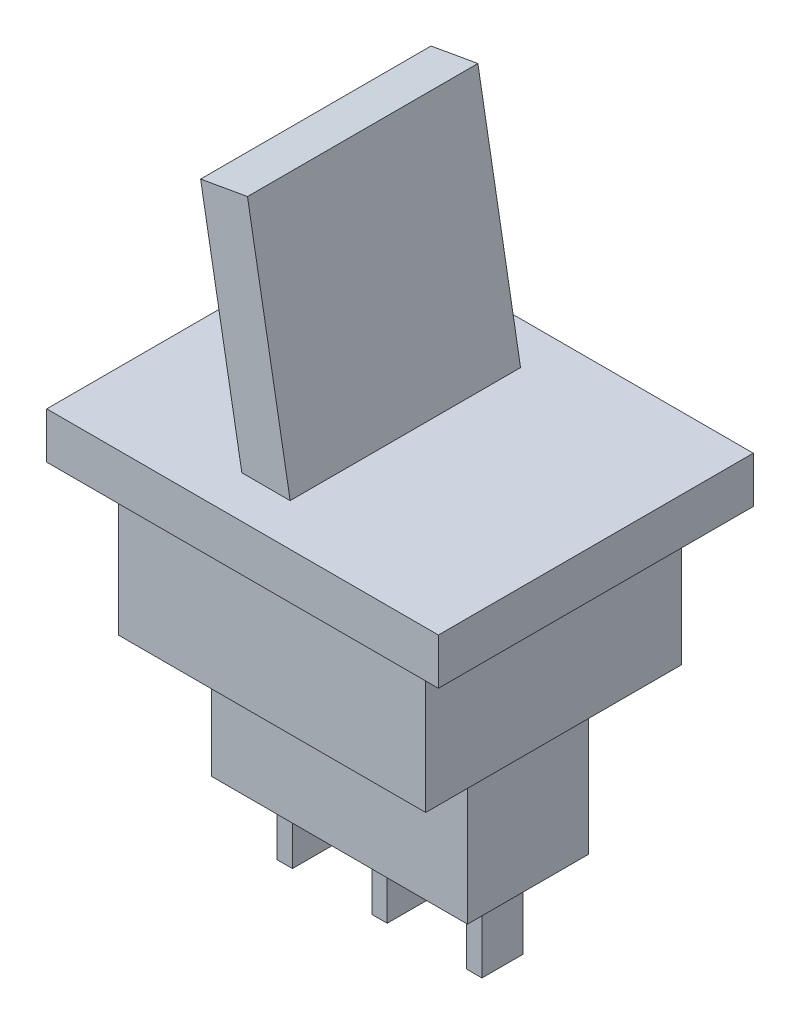
ISO-10303-21;
HEADER;
FILE_DESCRIPTION(('STEP AP214'),'2;1');
FILE_NAME('part.step','',(''),(''),'','','');
FILE_SCHEMA(('AUTOMOTIVE_DESIGN { 1 0 10303 214 1 1 1 1 }'));
ENDSEC;
DATA;
#1=APPLICATION_CONTEXT('core data for automotive mechanical design processes');
#2=APPLICATION_PROTOCOL_DEFINITION('international standard','automotive_design',2000,#1);
#3=PRODUCT_CONTEXT('',#1,'mechanical');
#4=PRODUCT('Part','Part','',(#3));
#5=PRODUCT_RELATED_PRODUCT_CATEGORY('part','',(#4));
#6=PRODUCT_DEFINITION_FORMATION('','',#4);
#7=PRODUCT_DEFINITION_CONTEXT('part definition',#1,'design');
#8=PRODUCT_DEFINITION('design','',#6,#7);
#9=PRODUCT_DEFINITION_SHAPE('','',#8);
#10=(LENGTH_UNIT() NAMED_UNIT(*) SI_UNIT(.MILLI.,.METRE.));
#11=(NAMED_UNIT(*) PLANE_ANGLE_UNIT() SI_UNIT($,.RADIAN.));
#12=(NAMED_UNIT(*) SI_UNIT($,.STERADIAN.) SOLID_ANGLE_UNIT());
#13=UNCERTAINTY_MEASURE_WITH_UNIT(LENGTH_MEASURE(1.E-05),#10,'distance_accuracy_value','');
#14=(GEOMETRIC_REPRESENTATION_CONTEXT(3) GLOBAL_UNCERTAINTY_ASSIGNED_CONTEXT((#13)) GLOBAL_UNIT_ASSIGNED_CONTEXT((#10,
#11,#12)) REPRESENTATION_CONTEXT('',''));
#15=CARTESIAN_POINT('',(0.,0.,0.));
#16=DIRECTION('',(0.,0.,1.));
#17=DIRECTION('',(1.,0.,0.));
#18=AXIS2_PLACEMENT_3D('',#15,#16,#17);
#19=CARTESIAN_POINT('',(0.,-14.22,0.));
#20=DIRECTION('',(0.,-1.,0.));
#21=DIRECTION('',(0.,0.,-1.));
#22=AXIS2_PLACEMENT_3D('',#19,#20,#21);
#23=PLANE('',#22);
#24=DIRECTION('',(0.,0.,1.));
#25=VECTOR('',#24,1.);
#26=CARTESIAN_POINT('',(6.35,-14.22,3.));
#27=LINE('',#26,#25);
#28=CARTESIAN_POINT('',(6.35,-14.22,-3.));
#29=VERTEX_POINT('',#28);
#30=CARTESIAN_POINT('',(6.35,-14.22,3.));
#31=VERTEX_POINT('',#30);
#32=EDGE_CURVE('E334',#29,#31,#27,.T.);
#33=ORIENTED_EDGE('',*,*,#32,.T.);
#34=DIRECTION('',(-1.,0.,0.));
#35=VECTOR('',#34,1.);
#36=CARTESIAN_POINT('',(-6.35,-14.22,3.));
#37=LINE('',#36,#35);
#38=CARTESIAN_POINT('',(-6.35,-14.22,3.));
#39=VERTEX_POINT('',#38);
#40=EDGE_CURVE('E337',#31,#39,#37,.T.);
#41=ORIENTED_EDGE('',*,*,#40,.T.);
#42=DIRECTION('',(0.,0.,-1.));
#43=VECTOR('',#42,1.);
#44=CARTESIAN_POINT('',(-6.35,-14.22,3.));
#45=LINE('',#44,#43);
#46=CARTESIAN_POINT('',(-6.35,-14.22,-3.));
#47=VERTEX_POINT('',#46);
#48=EDGE_CURVE('E340',#39,#47,#45,.T.);
#49=ORIENTED_EDGE('',*,*,#48,.T.);
#50=DIRECTION('',(1.,0.,0.));
#51=VECTOR('',#50,1.);
#52=CARTESIAN_POINT('',(-6.35,-14.22,-3.));
#53=LINE('',#52,#51);
#54=EDGE_CURVE('E342',#47,#29,#53,.T.);
#55=ORIENTED_EDGE('',*,*,#54,.T.);
#56=EDGE_LOOP('',(#33,#41,#49,#55));
#57=FACE_BOUND('',#56,.T.);
#58=DIRECTION('',(-1.,0.,0.));
#59=VECTOR('',#58,1.);
#60=CARTESIAN_POINT('',(-5.08,-14.22,1.015));
#61=LINE('',#60,#59);
#62=CARTESIAN_POINT('',(-4.32,-14.22,1.015));
#63=VERTEX_POINT('',#62);
#64=CARTESIAN_POINT('',(-5.08,-14.22,1.015));
#65=VERTEX_POINT('',#64);
#66=EDGE_CURVE('E318',#63,#65,#61,.T.);
#67=ORIENTED_EDGE('',*,*,#66,.F.);
#68=DIRECTION('',(0.,0.,1.));
#69=VECTOR('',#68,1.);
#70=CARTESIAN_POINT('',(-4.32,-14.22,1.015));
#71=LINE('',#70,#69);
#72=CARTESIAN_POINT('',(-4.32,-14.22,-1.015));
#73=VERTEX_POINT('',#72);
#74=EDGE_CURVE('E304',#73,#63,#71,.T.);
#75=ORIENTED_EDGE('',*,*,#74,.F.);
#76=DIRECTION('',(1.,0.,0.));
#77=VECTOR('',#76,1.);
#78=CARTESIAN_POINT('',(-5.08,-14.22,-1.015));
#79=LINE('',#78,#77);
#80=CARTESIAN_POINT('',(-5.08,-14.22,-1.015));
#81=VERTEX_POINT('',#80);
#82=EDGE_CURVE('E309',#81,#73,#79,.T.);
#83=ORIENTED_EDGE('',*,*,#82,.F.);
#84=DIRECTION('',(0.,0.,-1.));
#85=VECTOR('',#84,1.);
#86=CARTESIAN_POINT('',(-5.08,-14.22,1.015));
#87=LINE('',#86,#85);
#88=EDGE_CURVE('E320',#65,#81,#87,.T.);
#89=ORIENTED_EDGE('',*,*,#88,.F.);
#90=EDGE_LOOP('',(#67,#75,#83,#89));
#91=FACE_BOUND('',#90,.T.);
#92=DIRECTION('',(0.,0.,1.));
#93=VECTOR('',#92,1.);
#94=CARTESIAN_POINT('',(0.38,-14.22,1.015));
#95=LINE('',#94,#93);
#96=CARTESIAN_POINT('',(0.38,-14.22,-1.015));
#97=VERTEX_POINT('',#96);
#98=CARTESIAN_POINT('',(0.38,-14.22,1.015));
#99=VERTEX_POINT('',#98);
#100=EDGE_CURVE('E289',#97,#99,#95,.T.);
#101=ORIENTED_EDGE('',*,*,#100,.F.);
#102=DIRECTION('',(1.,0.,0.));
#103=VECTOR('',#102,1.);
#104=CARTESIAN_POINT('',(-0.38,-14.22,-1.015));
#105=LINE('',#104,#103);
#106=CARTESIAN_POINT('',(-0.38,-14.22,-1.015));
#107=VERTEX_POINT('',#106);
#108=EDGE_CURVE('E275',#107,#97,#105,.T.);
#109=ORIENTED_EDGE('',*,*,#108,.F.);
#110=DIRECTION('',(0.,0.,-1.));
#111=VECTOR('',#110,1.);
#112=CARTESIAN_POINT('',(-0.38,-14.22,1.015));
#113=LINE('',#112,#111);
#114=CARTESIAN_POINT('',(-0.38,-14.22,1.015));
#115=VERTEX_POINT('',#114);
#116=EDGE_CURVE('E280',#115,#107,#113,.T.);
#117=ORIENTED_EDGE('',*,*,#116,.F.);
#118=DIRECTION('',(-1.,0.,0.));
#119=VECTOR('',#118,1.);
#120=CARTESIAN_POINT('',(-0.38,-14.22,1.015));
#121=LINE('',#120,#119);
#122=EDGE_CURVE('E291',#99,#115,#121,.T.);
#123=ORIENTED_EDGE('',*,*,#122,.F.);
#124=EDGE_LOOP('',(#101,#109,#117,#123));
#125=FACE_BOUND('',#124,.T.);
#126=DIRECTION('',(0.,0.,1.));
#127=VECTOR('',#126,1.);
#128=CARTESIAN_POINT('',(5.08,-14.22,1.015));
#129=LINE('',#128,#127);
#130=CARTESIAN_POINT('',(5.08,-14.22,-1.015));
#131=VERTEX_POINT('',#130);
#132=CARTESIAN_POINT('',(5.08,-14.22,1.015));
#133=VERTEX_POINT('',#132);
#134=EDGE_CURVE('E260',#131,#133,#129,.T.);
#135=ORIENTED_EDGE('',*,*,#134,.F.);
#136=DIRECTION('',(1.,0.,0.));
#137=VECTOR('',#136,1.);
#138=CARTESIAN_POINT('',(4.32,-14.22,-1.015));
#139=LINE('',#138,#137);
#140=CARTESIAN_POINT('',(4.32,-14.22,-1.015));
#141=VERTEX_POINT('',#140);
#142=EDGE_CURVE('E245',#141,#131,#139,.T.);
#143=ORIENTED_EDGE('',*,*,#142,.F.);
#144=DIRECTION('',(0.,0.,-1.));
#145=VECTOR('',#144,1.);
#146=CARTESIAN_POINT('',(4.32,-14.22,1.015));
#147=LINE('',#146,#145);
#148=CARTESIAN_POINT('',(4.32,-14.22,1.015));
#149=VERTEX_POINT('',#148);
#150=EDGE_CURVE('E251',#149,#141,#147,.T.);
#151=ORIENTED_EDGE('',*,*,#150,.F.);
#152=DIRECTION('',(-1.,0.,0.));
#153=VECTOR('',#152,1.);
#154=CARTESIAN_POINT('',(4.32,-14.22,1.015));
#155=LINE('',#154,#153);
#156=EDGE_CURVE('E262',#133,#149,#155,.T.);
#157=ORIENTED_EDGE('',*,*,#156,.F.);
#158=EDGE_LOOP('',(#135,#143,#151,#157));
#159=FACE_BOUND('',#158,.T.);
#160=ADVANCED_FACE('F33',(#57,#91,#125,#159),#23,.T.);
#161=CARTESIAN_POINT('',(0.,-7.11,0.));
#162=DIRECTION('',(0.,1.,0.));
#163=DIRECTION('',(0.,0.,1.));
#164=AXIS2_PLACEMENT_3D('',#161,#162,#163);
#165=PLANE('',#164);
#166=DIRECTION('',(0.,0.,1.));
#167=VECTOR('',#166,1.);
#168=CARTESIAN_POINT('',(7.625,-7.11,-6.35));
#169=LINE('',#168,#167);
#170=CARTESIAN_POINT('',(7.625,-7.11,-6.35));
#171=VERTEX_POINT('',#170);
#172=CARTESIAN_POINT('',(7.625,-7.11,6.35));
#173=VERTEX_POINT('',#172);
#174=EDGE_CURVE('E367',#171,#173,#169,.T.);
#175=ORIENTED_EDGE('',*,*,#174,.T.);
#176=DIRECTION('',(-1.,0.,0.));
#177=VECTOR('',#176,1.);
#178=CARTESIAN_POINT('',(-7.625,-7.11,6.35));
#179=LINE('',#178,#177);
#180=CARTESIAN_POINT('',(-7.625,-7.11,6.35));
#181=VERTEX_POINT('',#180);
#182=EDGE_CURVE('E370',#173,#181,#179,.T.);
#183=ORIENTED_EDGE('',*,*,#182,.T.);
#184=DIRECTION('',(0.,0.,-1.));
#185=VECTOR('',#184,1.);
#186=CARTESIAN_POINT('',(-7.625,-7.11,-6.35));
#187=LINE('',#186,#185);
#188=CARTESIAN_POINT('',(-7.625,-7.11,-6.35));
#189=VERTEX_POINT('',#188);
#190=EDGE_CURVE('E373',#181,#189,#187,.T.);
#191=ORIENTED_EDGE('',*,*,#190,.T.);
#192=DIRECTION('',(1.,0.,0.));
#193=VECTOR('',#192,1.);
#194=CARTESIAN_POINT('',(-7.625,-7.11,-6.35));
#195=LINE('',#194,#193);
#196=EDGE_CURVE('E375',#189,#171,#195,.T.);
#197=ORIENTED_EDGE('',*,*,#196,.T.);
#198=EDGE_LOOP('',(#175,#183,#191,#197));
#199=FACE_BOUND('',#198,.T.);
#200=DIRECTION('',(0.,0.,1.));
#201=VECTOR('',#200,1.);
#202=CARTESIAN_POINT('',(6.35,-7.11,3.));
#203=LINE('',#202,#201);
#204=CARTESIAN_POINT('',(6.35,-7.11,-3.));
#205=VERTEX_POINT('',#204);
#206=CARTESIAN_POINT('',(6.35,-7.11,3.));
#207=VERTEX_POINT('',#206);
#208=EDGE_CURVE('E333',#205,#207,#203,.T.);
#209=ORIENTED_EDGE('',*,*,#208,.F.);
#210=DIRECTION('',(1.,0.,0.));
#211=VECTOR('',#210,1.);
#212=CARTESIAN_POINT('',(-6.35,-7.11,-3.));
#213=LINE('',#212,#211);
#214=CARTESIAN_POINT('',(-6.35,-7.11,-3.));
#215=VERTEX_POINT('',#214);
#216=EDGE_CURVE('E338',#215,#205,#213,.T.);
#217=ORIENTED_EDGE('',*,*,#216,.F.);
#218=DIRECTION('',(0.,0.,-1.));
#219=VECTOR('',#218,1.);
#220=CARTESIAN_POINT('',(-6.35,-7.11,3.));
#221=LINE('',#220,#219);
#222=CARTESIAN_POINT('',(-6.35,-7.11,3.));
#223=VERTEX_POINT('',#222);
#224=EDGE_CURVE('E350',#223,#215,#221,.T.);
#225=ORIENTED_EDGE('',*,*,#224,.F.);
#226=DIRECTION('',(-1.,0.,0.));
#227=VECTOR('',#226,1.);
#228=CARTESIAN_POINT('',(-6.35,-7.11,3.));
#229=LINE('',#228,#227);
#230=EDGE_CURVE('E347',#207,#223,#229,.T.);
#231=ORIENTED_EDGE('',*,*,#230,.F.);
#232=EDGE_LOOP('',(#209,#217,#225,#231));
#233=FACE_BOUND('',#232,.T.);
#234=ADVANCED_FACE('F450',(#199,#233),#165,.F.);
#235=CARTESIAN_POINT('',(9.715,2.29,7.81));
#236=DIRECTION('',(-1.,0.,0.));
#237=DIRECTION('',(0.,0.,1.));
#238=AXIS2_PLACEMENT_3D('',#235,#236,#237);
#239=PLANE('',#238);
#240=DIRECTION('',(0.,0.,-1.));
#241=VECTOR('',#240,1.);
#242=CARTESIAN_POINT('',(9.715,0.,7.81));
#243=LINE('',#242,#241);
#244=CARTESIAN_POINT('',(9.715,0.,7.81));
#245=VERTEX_POINT('',#244);
#246=CARTESIAN_POINT('',(9.715,0.,-7.81));
#247=VERTEX_POINT('',#246);
#248=EDGE_CURVE('E399',#245,#247,#243,.T.);
#249=ORIENTED_EDGE('',*,*,#248,.T.);
#250=DIRECTION('',(0.,-1.,0.));
#251=VECTOR('',#250,1.);
#252=CARTESIAN_POINT('',(9.715,2.29,-7.81));
#253=LINE('',#252,#251);
#254=CARTESIAN_POINT('',(9.715,2.29,-7.81));
#255=VERTEX_POINT('',#254);
#256=EDGE_CURVE('E426',#255,#247,#253,.T.);
#257=ORIENTED_EDGE('',*,*,#256,.F.);
#258=DIRECTION('',(0.,0.,-1.));
#259=VECTOR('',#258,1.);
#260=CARTESIAN_POINT('',(9.715,2.29,7.81));
#261=LINE('',#260,#259);
#262=CARTESIAN_POINT('',(9.715,2.29,7.81));
#263=VERTEX_POINT('',#262);
#264=EDGE_CURVE('E400',#263,#255,#261,.T.);
#265=ORIENTED_EDGE('',*,*,#264,.F.);
#266=DIRECTION('',(0.,-1.,0.));
#267=VECTOR('',#266,1.);
#268=CARTESIAN_POINT('',(9.715,2.29,7.81));
#269=LINE('',#268,#267);
#270=EDGE_CURVE('E410',#263,#245,#269,.T.);
#271=ORIENTED_EDGE('',*,*,#270,.T.);
#272=EDGE_LOOP('',(#249,#257,#265,#271));
#273=FACE_BOUND('',#272,.T.);
#274=ADVANCED_FACE('F35',(#273),#239,.F.);
#275=CARTESIAN_POINT('',(-9.715,2.29,-7.81));
#276=DIRECTION('',(0.,0.,1.));
#277=DIRECTION('',(1.,0.,0.));
#278=AXIS2_PLACEMENT_3D('',#275,#276,#277);
#279=PLANE('',#278);
#280=DIRECTION('',(-1.,0.,0.));
#281=VECTOR('',#280,1.);
#282=CARTESIAN_POINT('',(-9.715,0.,-7.81));
#283=LINE('',#282,#281);
#284=CARTESIAN_POINT('',(-9.715,0.,-7.81));
#285=VERTEX_POINT('',#284);
#286=EDGE_CURVE('E413',#247,#285,#283,.T.);
#287=ORIENTED_EDGE('',*,*,#286,.T.);
#288=DIRECTION('',(0.,-1.,0.));
#289=VECTOR('',#288,1.);
#290=CARTESIAN_POINT('',(-9.715,2.29,-7.81));
#291=LINE('',#290,#289);
#292=CARTESIAN_POINT('',(-9.715,2.29,-7.81));
#293=VERTEX_POINT('',#292);
#294=EDGE_CURVE('E423',#293,#285,#291,.T.);
#295=ORIENTED_EDGE('',*,*,#294,.F.);
#296=DIRECTION('',(-1.,0.,0.));
#297=VECTOR('',#296,1.);
#298=CARTESIAN_POINT('',(-9.715,2.29,-7.81));
#299=LINE('',#298,#297);
#300=EDGE_CURVE('E403',#255,#293,#299,.T.);
#301=ORIENTED_EDGE('',*,*,#300,.F.);
#302=ORIENTED_EDGE('',*,*,#256,.T.);
#303=EDGE_LOOP('',(#287,#295,#301,#302));
#304=FACE_BOUND('',#303,.T.);
#305=ADVANCED_FACE('F507',(#304),#279,.F.);
#306=CARTESIAN_POINT('',(-9.715,2.29,7.81));
#307=DIRECTION('',(1.,0.,0.));
#308=DIRECTION('',(0.,0.,-1.));
#309=AXIS2_PLACEMENT_3D('',#306,#307,#308);
#310=PLANE('',#309);
#311=DIRECTION('',(0.,0.,1.));
#312=VECTOR('',#311,1.);
#313=CARTESIAN_POINT('',(-9.715,0.,7.81));
#314=LINE('',#313,#312);
#315=CARTESIAN_POINT('',(-9.715,0.,7.81));
#316=VERTEX_POINT('',#315);
#317=EDGE_CURVE('E415',#285,#316,#314,.T.);
#318=ORIENTED_EDGE('',*,*,#317,.T.);
#319=DIRECTION('',(0.,-1.,0.));
#320=VECTOR('',#319,1.);
#321=CARTESIAN_POINT('',(-9.715,2.29,7.81));
#322=LINE('',#321,#320);
#323=CARTESIAN_POINT('',(-9.715,2.29,7.81));
#324=VERTEX_POINT('',#323);
#325=EDGE_CURVE('E420',#324,#316,#322,.T.);
#326=ORIENTED_EDGE('',*,*,#325,.F.);
#327=DIRECTION('',(0.,0.,1.));
#328=VECTOR('',#327,1.);
#329=CARTESIAN_POINT('',(-9.715,2.29,7.81));
#330=LINE('',#329,#328);
#331=EDGE_CURVE('E406',#293,#324,#330,.T.);
#332=ORIENTED_EDGE('',*,*,#331,.F.);
#333=ORIENTED_EDGE('',*,*,#294,.T.);
#334=EDGE_LOOP('',(#318,#326,#332,#333));
#335=FACE_BOUND('',#334,.T.);
#336=ADVANCED_FACE('F504',(#335),#310,.F.);
#337=CARTESIAN_POINT('',(-9.715,2.29,7.81));
#338=DIRECTION('',(0.,0.,-1.));
#339=DIRECTION('',(-1.,0.,0.));
#340=AXIS2_PLACEMENT_3D('',#337,#338,#339);
#341=PLANE('',#340);
#342=DIRECTION('',(1.,0.,0.));
#343=VECTOR('',#342,1.);
#344=CARTESIAN_POINT('',(-9.715,0.,7.81));
#345=LINE('',#344,#343);
#346=EDGE_CURVE('E404',#316,#245,#345,.T.);
#347=ORIENTED_EDGE('',*,*,#346,.T.);
#348=ORIENTED_EDGE('',*,*,#270,.F.);
#349=DIRECTION('',(1.,0.,0.));
#350=VECTOR('',#349,1.);
#351=CARTESIAN_POINT('',(-9.715,2.29,7.81));
#352=LINE('',#351,#350);
#353=EDGE_CURVE('E408',#324,#263,#352,.T.);
#354=ORIENTED_EDGE('',*,*,#353,.F.);
#355=ORIENTED_EDGE('',*,*,#325,.T.);
#356=EDGE_LOOP('',(#347,#348,#354,#355));
#357=FACE_BOUND('',#356,.T.);
#358=ADVANCED_FACE('F498',(#357),#341,.F.);
#359=CARTESIAN_POINT('',(0.,2.29,0.));
#360=DIRECTION('',(0.,-1.,0.));
#361=DIRECTION('',(0.,0.,-1.));
#362=AXIS2_PLACEMENT_3D('',#359,#360,#361);
#363=PLANE('',#362);
#364=DIRECTION('',(0.,0.,-1.));
#365=VECTOR('',#364,1.);
#366=CARTESIAN_POINT('',(-2.13097312997299,2.29,0.));
#367=LINE('',#366,#365);
#368=CARTESIAN_POINT('',(-2.13097312997299,2.29,5.715));
#369=VERTEX_POINT('',#368);
#370=CARTESIAN_POINT('',(-2.13097312997299,2.29,-5.715));
#371=VERTEX_POINT('',#370);
#372=EDGE_CURVE('E41',#369,#371,#367,.T.);
#373=ORIENTED_EDGE('',*,*,#372,.T.);
#374=DIRECTION('',(1.,0.,0.));
#375=VECTOR('',#374,1.);
#376=CARTESIAN_POINT('',(0.,2.29,-5.715));
#377=LINE('',#376,#375);
#378=CARTESIAN_POINT('',(0.265433674077377,2.29,-5.715));
#379=VERTEX_POINT('',#378);
#380=EDGE_CURVE('E11',#371,#379,#377,.T.);
#381=ORIENTED_EDGE('',*,*,#380,.T.);
#382=DIRECTION('',(0.,0.,1.));
#383=VECTOR('',#382,1.);
#384=CARTESIAN_POINT('',(0.265433674077377,2.29,0.));
#385=LINE('',#384,#383);
#386=CARTESIAN_POINT('',(0.265433674077377,2.29,5.715));
#387=VERTEX_POINT('',#386);
#388=EDGE_CURVE('E430',#379,#387,#385,.T.);
#389=ORIENTED_EDGE('',*,*,#388,.T.);
#390=DIRECTION('',(1.,0.,0.));
#391=VECTOR('',#390,1.);
#392=CARTESIAN_POINT('',(0.,2.29,5.715));
#393=LINE('',#392,#391);
#394=EDGE_CURVE('E221',#369,#387,#393,.T.);
#395=ORIENTED_EDGE('',*,*,#394,.F.);
#396=EDGE_LOOP('',(#373,#381,#389,#395));
#397=FACE_BOUND('',#396,.T.);
#398=ORIENTED_EDGE('',*,*,#264,.T.);
#399=ORIENTED_EDGE('',*,*,#300,.T.);
#400=ORIENTED_EDGE('',*,*,#331,.T.);
#401=ORIENTED_EDGE('',*,*,#353,.T.);
#402=EDGE_LOOP('',(#398,#399,#400,#401));
#403=FACE_BOUND('',#402,.T.);
#404=ADVANCED_FACE('F431',(#397,#403),#363,.F.);
#405=CARTESIAN_POINT('',(0.,0.,0.));
#406=DIRECTION('',(0.,-1.,0.));
#407=DIRECTION('',(0.,0.,-1.));
#408=AXIS2_PLACEMENT_3D('',#405,#406,#407);
#409=PLANE('',#408);
#410=DIRECTION('',(0.,0.,1.));
#411=VECTOR('',#410,1.);
#412=CARTESIAN_POINT('',(7.625,0.,-6.35));
#413=LINE('',#412,#411);
#414=CARTESIAN_POINT('',(7.625,0.,-6.35));
#415=VERTEX_POINT('',#414);
#416=CARTESIAN_POINT('',(7.625,0.,6.35));
#417=VERTEX_POINT('',#416);
#418=EDGE_CURVE('E366',#415,#417,#413,.T.);
#419=ORIENTED_EDGE('',*,*,#418,.F.);
#420=DIRECTION('',(1.,0.,0.));
#421=VECTOR('',#420,1.);
#422=CARTESIAN_POINT('',(-7.625,0.,-6.35));
#423=LINE('',#422,#421);
#424=CARTESIAN_POINT('',(-7.625,0.,-6.35));
#425=VERTEX_POINT('',#424);
#426=EDGE_CURVE('E371',#425,#415,#423,.T.);
#427=ORIENTED_EDGE('',*,*,#426,.F.);
#428=DIRECTION('',(0.,0.,-1.));
#429=VECTOR('',#428,1.);
#430=CARTESIAN_POINT('',(-7.625,0.,-6.35));
#431=LINE('',#430,#429);
#432=CARTESIAN_POINT('',(-7.625,0.,6.35));
#433=VERTEX_POINT('',#432);
#434=EDGE_CURVE('E383',#433,#425,#431,.T.);
#435=ORIENTED_EDGE('',*,*,#434,.F.);
#436=DIRECTION('',(-1.,0.,0.));
#437=VECTOR('',#436,1.);
#438=CARTESIAN_POINT('',(-7.625,0.,6.35));
#439=LINE('',#438,#437);
#440=EDGE_CURVE('E380',#417,#433,#439,.T.);
#441=ORIENTED_EDGE('',*,*,#440,.F.);
#442=EDGE_LOOP('',(#419,#427,#435,#441));
#443=FACE_BOUND('',#442,.T.);
#444=ORIENTED_EDGE('',*,*,#248,.F.);
#445=ORIENTED_EDGE('',*,*,#346,.F.);
#446=ORIENTED_EDGE('',*,*,#317,.F.);
#447=ORIENTED_EDGE('',*,*,#286,.F.);
#448=EDGE_LOOP('',(#444,#445,#446,#447));
#449=FACE_BOUND('',#448,.T.);
#450=ADVANCED_FACE('F494',(#443,#449),#409,.T.);
#451=CARTESIAN_POINT('',(7.625,-7.11,-6.35));
#452=DIRECTION('',(-1.,0.,0.));
#453=DIRECTION('',(0.,0.,1.));
#454=AXIS2_PLACEMENT_3D('',#451,#452,#453);
#455=PLANE('',#454);
#456=ORIENTED_EDGE('',*,*,#418,.T.);
#457=DIRECTION('',(0.,1.,0.));
#458=VECTOR('',#457,1.);
#459=CARTESIAN_POINT('',(7.625,-7.11,6.35));
#460=LINE('',#459,#458);
#461=EDGE_CURVE('E396',#173,#417,#460,.T.);
#462=ORIENTED_EDGE('',*,*,#461,.F.);
#463=ORIENTED_EDGE('',*,*,#174,.F.);
#464=DIRECTION('',(0.,1.,0.));
#465=VECTOR('',#464,1.);
#466=CARTESIAN_POINT('',(7.625,-7.11,-6.35));
#467=LINE('',#466,#465);
#468=EDGE_CURVE('E377',#171,#415,#467,.T.);
#469=ORIENTED_EDGE('',*,*,#468,.T.);
#470=EDGE_LOOP('',(#456,#462,#463,#469));
#471=FACE_BOUND('',#470,.T.);
#472=ADVANCED_FACE('F490',(#471),#455,.F.);
#473=CARTESIAN_POINT('',(-7.625,-7.11,6.35));
#474=DIRECTION('',(0.,0.,-1.));
#475=DIRECTION('',(-1.,0.,0.));
#476=AXIS2_PLACEMENT_3D('',#473,#474,#475);
#477=PLANE('',#476);
#478=ORIENTED_EDGE('',*,*,#440,.T.);
#479=DIRECTION('',(0.,1.,0.));
#480=VECTOR('',#479,1.);
#481=CARTESIAN_POINT('',(-7.625,-7.11,6.35));
#482=LINE('',#481,#480);
#483=EDGE_CURVE('E393',#181,#433,#482,.T.);
#484=ORIENTED_EDGE('',*,*,#483,.F.);
#485=ORIENTED_EDGE('',*,*,#182,.F.);
#486=ORIENTED_EDGE('',*,*,#461,.T.);
#487=EDGE_LOOP('',(#478,#484,#485,#486));
#488=FACE_BOUND('',#487,.T.);
#489=ADVANCED_FACE('F486',(#488),#477,.F.);
#490=CARTESIAN_POINT('',(-7.625,-7.11,-6.35));
#491=DIRECTION('',(1.,0.,0.));
#492=DIRECTION('',(0.,0.,-1.));
#493=AXIS2_PLACEMENT_3D('',#490,#491,#492);
#494=PLANE('',#493);
#495=ORIENTED_EDGE('',*,*,#434,.T.);
#496=DIRECTION('',(0.,1.,0.));
#497=VECTOR('',#496,1.);
#498=CARTESIAN_POINT('',(-7.625,-7.11,-6.35));
#499=LINE('',#498,#497);
#500=EDGE_CURVE('E390',#189,#425,#499,.T.);
#501=ORIENTED_EDGE('',*,*,#500,.F.);
#502=ORIENTED_EDGE('',*,*,#190,.F.);
#503=ORIENTED_EDGE('',*,*,#483,.T.);
#504=EDGE_LOOP('',(#495,#501,#502,#503));
#505=FACE_BOUND('',#504,.T.);
#506=ADVANCED_FACE('F482',(#505),#494,.F.);
#507=CARTESIAN_POINT('',(-7.625,-7.11,-6.35));
#508=DIRECTION('',(0.,0.,1.));
#509=DIRECTION('',(1.,0.,0.));
#510=AXIS2_PLACEMENT_3D('',#507,#508,#509);
#511=PLANE('',#510);
#512=ORIENTED_EDGE('',*,*,#426,.T.);
#513=ORIENTED_EDGE('',*,*,#468,.F.);
#514=ORIENTED_EDGE('',*,*,#196,.F.);
#515=ORIENTED_EDGE('',*,*,#500,.T.);
#516=EDGE_LOOP('',(#512,#513,#514,#515));
#517=FACE_BOUND('',#516,.T.);
#518=ADVANCED_FACE('F477',(#517),#511,.F.);
#519=CARTESIAN_POINT('',(6.35,-14.22,3.));
#520=DIRECTION('',(-1.,0.,0.));
#521=DIRECTION('',(0.,0.,1.));
#522=AXIS2_PLACEMENT_3D('',#519,#520,#521);
#523=PLANE('',#522);
#524=ORIENTED_EDGE('',*,*,#208,.T.);
#525=DIRECTION('',(0.,1.,0.));
#526=VECTOR('',#525,1.);
#527=CARTESIAN_POINT('',(6.35,-14.22,3.));
#528=LINE('',#527,#526);
#529=EDGE_CURVE('E363',#31,#207,#528,.T.);
#530=ORIENTED_EDGE('',*,*,#529,.F.);
#531=ORIENTED_EDGE('',*,*,#32,.F.);
#532=DIRECTION('',(0.,1.,0.));
#533=VECTOR('',#532,1.);
#534=CARTESIAN_POINT('',(6.35,-14.22,-3.));
#535=LINE('',#534,#533);
#536=EDGE_CURVE('E344',#29,#205,#535,.T.);
#537=ORIENTED_EDGE('',*,*,#536,.T.);
#538=EDGE_LOOP('',(#524,#530,#531,#537));
#539=FACE_BOUND('',#538,.T.);
#540=ADVANCED_FACE('F474',(#539),#523,.F.);
#541=CARTESIAN_POINT('',(-6.35,-14.22,3.));
#542=DIRECTION('',(0.,0.,-1.));
#543=DIRECTION('',(-1.,0.,0.));
#544=AXIS2_PLACEMENT_3D('',#541,#542,#543);
#545=PLANE('',#544);
#546=ORIENTED_EDGE('',*,*,#230,.T.);
#547=DIRECTION('',(0.,1.,0.));
#548=VECTOR('',#547,1.);
#549=CARTESIAN_POINT('',(-6.35,-14.22,3.));
#550=LINE('',#549,#548);
#551=EDGE_CURVE('E360',#39,#223,#550,.T.);
#552=ORIENTED_EDGE('',*,*,#551,.F.);
#553=ORIENTED_EDGE('',*,*,#40,.F.);
#554=ORIENTED_EDGE('',*,*,#529,.T.);
#555=EDGE_LOOP('',(#546,#552,#553,#554));
#556=FACE_BOUND('',#555,.T.);
#557=ADVANCED_FACE('F470',(#556),#545,.F.);
#558=CARTESIAN_POINT('',(-6.35,-14.22,3.));
#559=DIRECTION('',(1.,0.,0.));
#560=DIRECTION('',(0.,0.,-1.));
#561=AXIS2_PLACEMENT_3D('',#558,#559,#560);
#562=PLANE('',#561);
#563=ORIENTED_EDGE('',*,*,#224,.T.);
#564=DIRECTION('',(0.,1.,0.));
#565=VECTOR('',#564,1.);
#566=CARTESIAN_POINT('',(-6.35,-14.22,-3.));
#567=LINE('',#566,#565);
#568=EDGE_CURVE('E357',#47,#215,#567,.T.);
#569=ORIENTED_EDGE('',*,*,#568,.F.);
#570=ORIENTED_EDGE('',*,*,#48,.F.);
#571=ORIENTED_EDGE('',*,*,#551,.T.);
#572=EDGE_LOOP('',(#563,#569,#570,#571));
#573=FACE_BOUND('',#572,.T.);
#574=ADVANCED_FACE('F466',(#573),#562,.F.);
#575=CARTESIAN_POINT('',(-6.35,-14.22,-3.));
#576=DIRECTION('',(0.,0.,1.));
#577=DIRECTION('',(1.,0.,0.));
#578=AXIS2_PLACEMENT_3D('',#575,#576,#577);
#579=PLANE('',#578);
#580=ORIENTED_EDGE('',*,*,#216,.T.);
#581=ORIENTED_EDGE('',*,*,#536,.F.);
#582=ORIENTED_EDGE('',*,*,#54,.F.);
#583=ORIENTED_EDGE('',*,*,#568,.T.);
#584=EDGE_LOOP('',(#580,#581,#582,#583));
#585=FACE_BOUND('',#584,.T.);
#586=ADVANCED_FACE('F463',(#585),#579,.F.);
#587=CARTESIAN_POINT('',(-4.32,-18.16,1.015));
#588=DIRECTION('',(-1.,0.,0.));
#589=DIRECTION('',(0.,0.,1.));
#590=AXIS2_PLACEMENT_3D('',#587,#588,#589);
#591=PLANE('',#590);
#592=ORIENTED_EDGE('',*,*,#74,.T.);
#593=DIRECTION('',(0.,1.,0.));
#594=VECTOR('',#593,1.);
#595=CARTESIAN_POINT('',(-4.32,-18.16,1.015));
#596=LINE('',#595,#594);
#597=CARTESIAN_POINT('',(-4.32,-18.16,1.015));
#598=VERTEX_POINT('',#597);
#599=EDGE_CURVE('E331',#598,#63,#596,.T.);
#600=ORIENTED_EDGE('',*,*,#599,.F.);
#601=DIRECTION('',(0.,0.,1.));
#602=VECTOR('',#601,1.);
#603=CARTESIAN_POINT('',(-4.32,-18.16,1.015));
#604=LINE('',#603,#602);
#605=CARTESIAN_POINT('',(-4.32,-18.16,-1.015));
#606=VERTEX_POINT('',#605);
#607=EDGE_CURVE('E305',#606,#598,#604,.T.);
#608=ORIENTED_EDGE('',*,*,#607,.F.);
#609=DIRECTION('',(0.,1.,0.));
#610=VECTOR('',#609,1.);
#611=CARTESIAN_POINT('',(-4.32,-18.16,-1.015));
#612=LINE('',#611,#610);
#613=EDGE_CURVE('E315',#606,#73,#612,.T.);
#614=ORIENTED_EDGE('',*,*,#613,.T.);
#615=EDGE_LOOP('',(#592,#600,#608,#614));
#616=FACE_BOUND('',#615,.T.);
#617=ADVANCED_FACE('F461',(#616),#591,.F.);
#618=CARTESIAN_POINT('',(-5.08,-18.16,1.015));
#619=DIRECTION('',(0.,0.,-1.));
#620=DIRECTION('',(-1.,0.,0.));
#621=AXIS2_PLACEMENT_3D('',#618,#619,#620);
#622=PLANE('',#621);
#623=ORIENTED_EDGE('',*,*,#66,.T.);
#624=DIRECTION('',(0.,1.,0.));
#625=VECTOR('',#624,1.);
#626=CARTESIAN_POINT('',(-5.08,-18.16,1.015));
#627=LINE('',#626,#625);
#628=CARTESIAN_POINT('',(-5.08,-18.16,1.015));
#629=VERTEX_POINT('',#628);
#630=EDGE_CURVE('E328',#629,#65,#627,.T.);
#631=ORIENTED_EDGE('',*,*,#630,.F.);
#632=DIRECTION('',(-1.,0.,0.));
#633=VECTOR('',#632,1.);
#634=CARTESIAN_POINT('',(-5.08,-18.16,1.015));
#635=LINE('',#634,#633);
#636=EDGE_CURVE('E308',#598,#629,#635,.T.);
#637=ORIENTED_EDGE('',*,*,#636,.F.);
#638=ORIENTED_EDGE('',*,*,#599,.T.);
#639=EDGE_LOOP('',(#623,#631,#637,#638));
#640=FACE_BOUND('',#639,.T.);
#641=ADVANCED_FACE('F573',(#640),#622,.F.);
#642=CARTESIAN_POINT('',(-5.08,-18.16,1.015));
#643=DIRECTION('',(1.,0.,0.));
#644=DIRECTION('',(0.,0.,-1.));
#645=AXIS2_PLACEMENT_3D('',#642,#643,#644);
#646=PLANE('',#645);
#647=ORIENTED_EDGE('',*,*,#88,.T.);
#648=DIRECTION('',(0.,1.,0.));
#649=VECTOR('',#648,1.);
#650=CARTESIAN_POINT('',(-5.08,-18.16,-1.015));
#651=LINE('',#650,#649);
#652=CARTESIAN_POINT('',(-5.08,-18.16,-1.015));
#653=VERTEX_POINT('',#652);
#654=EDGE_CURVE('E326',#653,#81,#651,.T.);
#655=ORIENTED_EDGE('',*,*,#654,.F.);
#656=DIRECTION('',(0.,0.,-1.));
#657=VECTOR('',#656,1.);
#658=CARTESIAN_POINT('',(-5.08,-18.16,1.015));
#659=LINE('',#658,#657);
#660=EDGE_CURVE('E311',#629,#653,#659,.T.);
#661=ORIENTED_EDGE('',*,*,#660,.F.);
#662=ORIENTED_EDGE('',*,*,#630,.T.);
#663=EDGE_LOOP('',(#647,#655,#661,#662));
#664=FACE_BOUND('',#663,.T.);
#665=ADVANCED_FACE('F582',(#664),#646,.F.);
#666=CARTESIAN_POINT('',(-5.08,-18.16,-1.015));
#667=DIRECTION('',(0.,0.,1.));
#668=DIRECTION('',(1.,0.,0.));
#669=AXIS2_PLACEMENT_3D('',#666,#667,#668);
#670=PLANE('',#669);
#671=ORIENTED_EDGE('',*,*,#82,.T.);
#672=ORIENTED_EDGE('',*,*,#613,.F.);
#673=DIRECTION('',(1.,0.,0.));
#674=VECTOR('',#673,1.);
#675=CARTESIAN_POINT('',(-5.08,-18.16,-1.015));
#676=LINE('',#675,#674);
#677=EDGE_CURVE('E313',#653,#606,#676,.T.);
#678=ORIENTED_EDGE('',*,*,#677,.F.);
#679=ORIENTED_EDGE('',*,*,#654,.T.);
#680=EDGE_LOOP('',(#671,#672,#678,#679));
#681=FACE_BOUND('',#680,.T.);
#682=ADVANCED_FACE('F591',(#681),#670,.F.);
#683=CARTESIAN_POINT('',(0.,-18.16,0.));
#684=DIRECTION('',(0.,-1.,0.));
#685=DIRECTION('',(0.,0.,-1.));
#686=AXIS2_PLACEMENT_3D('',#683,#684,#685);
#687=PLANE('',#686);
#688=ORIENTED_EDGE('',*,*,#607,.T.);
#689=ORIENTED_EDGE('',*,*,#636,.T.);
#690=ORIENTED_EDGE('',*,*,#660,.T.);
#691=ORIENTED_EDGE('',*,*,#677,.T.);
#692=EDGE_LOOP('',(#688,#689,#690,#691));
#693=FACE_BOUND('',#692,.T.);
#694=ADVANCED_FACE('F601',(#693),#687,.T.);
#695=CARTESIAN_POINT('',(-0.38,-18.16,-1.015));
#696=DIRECTION('',(0.,0.,1.));
#697=DIRECTION('',(1.,0.,0.));
#698=AXIS2_PLACEMENT_3D('',#695,#696,#697);
#699=PLANE('',#698);
#700=ORIENTED_EDGE('',*,*,#108,.T.);
#701=DIRECTION('',(0.,1.,0.));
#702=VECTOR('',#701,1.);
#703=CARTESIAN_POINT('',(0.38,-18.16,-1.015));
#704=LINE('',#703,#702);
#705=CARTESIAN_POINT('',(0.38,-18.16,-1.015));
#706=VERTEX_POINT('',#705);
#707=EDGE_CURVE('E302',#706,#97,#704,.T.);
#708=ORIENTED_EDGE('',*,*,#707,.F.);
#709=DIRECTION('',(1.,0.,0.));
#710=VECTOR('',#709,1.);
#711=CARTESIAN_POINT('',(-0.38,-18.16,-1.015));
#712=LINE('',#711,#710);
#713=CARTESIAN_POINT('',(-0.38,-18.16,-1.015));
#714=VERTEX_POINT('',#713);
#715=EDGE_CURVE('E276',#714,#706,#712,.T.);
#716=ORIENTED_EDGE('',*,*,#715,.F.);
#717=DIRECTION('',(0.,1.,0.));
#718=VECTOR('',#717,1.);
#719=CARTESIAN_POINT('',(-0.38,-18.16,-1.015));
#720=LINE('',#719,#718);
#721=EDGE_CURVE('E286',#714,#107,#720,.T.);
#722=ORIENTED_EDGE('',*,*,#721,.T.);
#723=EDGE_LOOP('',(#700,#708,#716,#722));
#724=FACE_BOUND('',#723,.T.);
#725=ADVANCED_FACE('F611',(#724),#699,.F.);
#726=CARTESIAN_POINT('',(0.38,-18.16,1.015));
#727=DIRECTION('',(-1.,0.,0.));
#728=DIRECTION('',(0.,0.,1.));
#729=AXIS2_PLACEMENT_3D('',#726,#727,#728);
#730=PLANE('',#729);
#731=ORIENTED_EDGE('',*,*,#100,.T.);
#732=DIRECTION('',(0.,1.,0.));
#733=VECTOR('',#732,1.);
#734=CARTESIAN_POINT('',(0.38,-18.16,1.015));
#735=LINE('',#734,#733);
#736=CARTESIAN_POINT('',(0.38,-18.16,1.015));
#737=VERTEX_POINT('',#736);
#738=EDGE_CURVE('E299',#737,#99,#735,.T.);
#739=ORIENTED_EDGE('',*,*,#738,.F.);
#740=DIRECTION('',(0.,0.,1.));
#741=VECTOR('',#740,1.);
#742=CARTESIAN_POINT('',(0.38,-18.16,1.015));
#743=LINE('',#742,#741);
#744=EDGE_CURVE('E279',#706,#737,#743,.T.);
#745=ORIENTED_EDGE('',*,*,#744,.F.);
#746=ORIENTED_EDGE('',*,*,#707,.T.);
#747=EDGE_LOOP('',(#731,#739,#745,#746));
#748=FACE_BOUND('',#747,.T.);
#749=ADVANCED_FACE('F621',(#748),#730,.F.);
#750=CARTESIAN_POINT('',(-0.38,-18.16,1.015));
#751=DIRECTION('',(0.,0.,-1.));
#752=DIRECTION('',(-1.,0.,0.));
#753=AXIS2_PLACEMENT_3D('',#750,#751,#752);
#754=PLANE('',#753);
#755=ORIENTED_EDGE('',*,*,#122,.T.);
#756=DIRECTION('',(0.,1.,0.));
#757=VECTOR('',#756,1.);
#758=CARTESIAN_POINT('',(-0.38,-18.16,1.015));
#759=LINE('',#758,#757);
#760=CARTESIAN_POINT('',(-0.38,-18.16,1.015));
#761=VERTEX_POINT('',#760);
#762=EDGE_CURVE('E297',#761,#115,#759,.T.);
#763=ORIENTED_EDGE('',*,*,#762,.F.);
#764=DIRECTION('',(-1.,0.,0.));
#765=VECTOR('',#764,1.);
#766=CARTESIAN_POINT('',(-0.38,-18.16,1.015));
#767=LINE('',#766,#765);
#768=EDGE_CURVE('E282',#737,#761,#767,.T.);
#769=ORIENTED_EDGE('',*,*,#768,.F.);
#770=ORIENTED_EDGE('',*,*,#738,.T.);
#771=EDGE_LOOP('',(#755,#763,#769,#770));
#772=FACE_BOUND('',#771,.T.);
#773=ADVANCED_FACE('F631',(#772),#754,.F.);
#774=CARTESIAN_POINT('',(-0.38,-18.16,1.015));
#775=DIRECTION('',(1.,0.,0.));
#776=DIRECTION('',(0.,0.,-1.));
#777=AXIS2_PLACEMENT_3D('',#774,#775,#776);
#778=PLANE('',#777);
#779=ORIENTED_EDGE('',*,*,#116,.T.);
#780=ORIENTED_EDGE('',*,*,#721,.F.);
#781=DIRECTION('',(0.,0.,-1.));
#782=VECTOR('',#781,1.);
#783=CARTESIAN_POINT('',(-0.38,-18.16,1.015));
#784=LINE('',#783,#782);
#785=EDGE_CURVE('E284',#761,#714,#784,.T.);
#786=ORIENTED_EDGE('',*,*,#785,.F.);
#787=ORIENTED_EDGE('',*,*,#762,.T.);
#788=EDGE_LOOP('',(#779,#780,#786,#787));
#789=FACE_BOUND('',#788,.T.);
#790=ADVANCED_FACE('F641',(#789),#778,.F.);
#791=CARTESIAN_POINT('',(0.,-18.16,0.));
#792=DIRECTION('',(0.,1.,0.));
#793=DIRECTION('',(0.,0.,1.));
#794=AXIS2_PLACEMENT_3D('',#791,#792,#793);
#795=PLANE('',#794);
#796=ORIENTED_EDGE('',*,*,#715,.T.);
#797=ORIENTED_EDGE('',*,*,#744,.T.);
#798=ORIENTED_EDGE('',*,*,#768,.T.);
#799=ORIENTED_EDGE('',*,*,#785,.T.);
#800=EDGE_LOOP('',(#796,#797,#798,#799));
#801=FACE_BOUND('',#800,.T.);
#802=ADVANCED_FACE('F651',(#801),#795,.F.);
#803=CARTESIAN_POINT('',(4.32,-18.16,-1.015));
#804=DIRECTION('',(0.,0.,1.));
#805=DIRECTION('',(1.,0.,0.));
#806=AXIS2_PLACEMENT_3D('',#803,#804,#805);
#807=PLANE('',#806);
#808=ORIENTED_EDGE('',*,*,#142,.T.);
#809=DIRECTION('',(0.,1.,0.));
#810=VECTOR('',#809,1.);
#811=CARTESIAN_POINT('',(5.08,-18.16,-1.015));
#812=LINE('',#811,#810);
#813=CARTESIAN_POINT('',(5.08,-18.16,-1.015));
#814=VERTEX_POINT('',#813);
#815=EDGE_CURVE('E273',#814,#131,#812,.T.);
#816=ORIENTED_EDGE('',*,*,#815,.F.);
#817=DIRECTION('',(1.,0.,0.));
#818=VECTOR('',#817,1.);
#819=CARTESIAN_POINT('',(4.32,-18.16,-1.015));
#820=LINE('',#819,#818);
#821=CARTESIAN_POINT('',(4.32,-18.16,-1.015));
#822=VERTEX_POINT('',#821);
#823=EDGE_CURVE('E247',#822,#814,#820,.T.);
#824=ORIENTED_EDGE('',*,*,#823,.F.);
#825=DIRECTION('',(0.,1.,0.));
#826=VECTOR('',#825,1.);
#827=CARTESIAN_POINT('',(4.32,-18.16,-1.015));
#828=LINE('',#827,#826);
#829=EDGE_CURVE('E257',#822,#141,#828,.T.);
#830=ORIENTED_EDGE('',*,*,#829,.T.);
#831=EDGE_LOOP('',(#808,#816,#824,#830));
#832=FACE_BOUND('',#831,.T.);
#833=ADVANCED_FACE('F661',(#832),#807,.F.);
#834=CARTESIAN_POINT('',(5.08,-18.16,1.015));
#835=DIRECTION('',(-1.,0.,0.));
#836=DIRECTION('',(0.,0.,1.));
#837=AXIS2_PLACEMENT_3D('',#834,#835,#836);
#838=PLANE('',#837);
#839=ORIENTED_EDGE('',*,*,#134,.T.);
#840=DIRECTION('',(0.,1.,0.));
#841=VECTOR('',#840,1.);
#842=CARTESIAN_POINT('',(5.08,-18.16,1.015));
#843=LINE('',#842,#841);
#844=CARTESIAN_POINT('',(5.08,-18.16,1.015));
#845=VERTEX_POINT('',#844);
#846=EDGE_CURVE('E270',#845,#133,#843,.T.);
#847=ORIENTED_EDGE('',*,*,#846,.F.);
#848=DIRECTION('',(0.,0.,1.));
#849=VECTOR('',#848,1.);
#850=CARTESIAN_POINT('',(5.08,-18.16,1.015));
#851=LINE('',#850,#849);
#852=EDGE_CURVE('E250',#814,#845,#851,.T.);
#853=ORIENTED_EDGE('',*,*,#852,.F.);
#854=ORIENTED_EDGE('',*,*,#815,.T.);
#855=EDGE_LOOP('',(#839,#847,#853,#854));
#856=FACE_BOUND('',#855,.T.);
#857=ADVANCED_FACE('F671',(#856),#838,.F.);
#858=CARTESIAN_POINT('',(4.32,-18.16,1.015));
#859=DIRECTION('',(0.,0.,-1.));
#860=DIRECTION('',(-1.,0.,0.));
#861=AXIS2_PLACEMENT_3D('',#858,#859,#860);
#862=PLANE('',#861);
#863=ORIENTED_EDGE('',*,*,#156,.T.);
#864=DIRECTION('',(0.,1.,0.));
#865=VECTOR('',#864,1.);
#866=CARTESIAN_POINT('',(4.32,-18.16,1.015));
#867=LINE('',#866,#865);
#868=CARTESIAN_POINT('',(4.32,-18.16,1.015));
#869=VERTEX_POINT('',#868);
#870=EDGE_CURVE('E268',#869,#149,#867,.T.);
#871=ORIENTED_EDGE('',*,*,#870,.F.);
#872=DIRECTION('',(-1.,0.,0.));
#873=VECTOR('',#872,1.);
#874=CARTESIAN_POINT('',(4.32,-18.16,1.015));
#875=LINE('',#874,#873);
#876=EDGE_CURVE('E253',#845,#869,#875,.T.);
#877=ORIENTED_EDGE('',*,*,#876,.F.);
#878=ORIENTED_EDGE('',*,*,#846,.T.);
#879=EDGE_LOOP('',(#863,#871,#877,#878));
#880=FACE_BOUND('',#879,.T.);
#881=ADVANCED_FACE('F681',(#880),#862,.F.);
#882=CARTESIAN_POINT('',(4.32,-18.16,1.015));
#883=DIRECTION('',(1.,0.,0.));
#884=DIRECTION('',(0.,0.,-1.));
#885=AXIS2_PLACEMENT_3D('',#882,#883,#884);
#886=PLANE('',#885);
#887=ORIENTED_EDGE('',*,*,#150,.T.);
#888=ORIENTED_EDGE('',*,*,#829,.F.);
#889=DIRECTION('',(0.,0.,-1.));
#890=VECTOR('',#889,1.);
#891=CARTESIAN_POINT('',(4.32,-18.16,1.015));
#892=LINE('',#891,#890);
#893=EDGE_CURVE('E255',#869,#822,#892,.T.);
#894=ORIENTED_EDGE('',*,*,#893,.F.);
#895=ORIENTED_EDGE('',*,*,#870,.T.);
#896=EDGE_LOOP('',(#887,#888,#894,#895));
#897=FACE_BOUND('',#896,.T.);
#898=ADVANCED_FACE('F446',(#897),#886,.F.);
#899=CARTESIAN_POINT('',(0.,-18.16,0.));
#900=DIRECTION('',(0.,1.,0.));
#901=DIRECTION('',(0.,0.,1.));
#902=AXIS2_PLACEMENT_3D('',#899,#900,#901);
#903=PLANE('',#902);
#904=ORIENTED_EDGE('',*,*,#823,.T.);
#905=ORIENTED_EDGE('',*,*,#852,.T.);
#906=ORIENTED_EDGE('',*,*,#876,.T.);
#907=ORIENTED_EDGE('',*,*,#893,.T.);
#908=EDGE_LOOP('',(#904,#905,#906,#907));
#909=FACE_BOUND('',#908,.T.);
#910=ADVANCED_FACE('F439',(#909),#903,.F.);
#911=CARTESIAN_POINT('',(-1.16207314855441,-3.20490484964698,-5.715));
#912=DIRECTION('',(-0.984807753012207,-0.173648177666935,0.));
#913=DIRECTION('',(0.173648177666935,-0.984807753012207,0.));
#914=AXIS2_PLACEMENT_3D('',#911,#912,#913);
#915=PLANE('',#914);
#916=ORIENTED_EDGE('',*,*,#372,.F.);
#917=DIRECTION('',(0.173648177666935,-0.984807753012207,0.));
#918=VECTOR('',#917,1.);
#919=CARTESIAN_POINT('',(-1.16207314855441,-3.20490484964698,5.715));
#920=LINE('',#919,#918);
#921=CARTESIAN_POINT('',(-4.17550124886215,13.885095150353,5.715));
#922=VERTEX_POINT('',#921);
#923=EDGE_CURVE('E223',#922,#369,#920,.T.);
#924=ORIENTED_EDGE('',*,*,#923,.F.);
#925=DIRECTION('',(0.,0.,1.));
#926=VECTOR('',#925,1.);
#927=CARTESIAN_POINT('',(-4.17550124886215,13.885095150353,-5.715));
#928=LINE('',#927,#926);
#929=CARTESIAN_POINT('',(-4.17550124886215,13.885095150353,-5.715));
#930=VERTEX_POINT('',#929);
#931=EDGE_CURVE('E233',#930,#922,#928,.T.);
#932=ORIENTED_EDGE('',*,*,#931,.F.);
#933=DIRECTION('',(0.173648177666935,-0.984807753012207,0.));
#934=VECTOR('',#933,1.);
#935=CARTESIAN_POINT('',(-1.16207314855441,-3.20490484964698,-5.715));
#936=LINE('',#935,#934);
#937=EDGE_CURVE('E237',#930,#371,#936,.T.);
#938=ORIENTED_EDGE('',*,*,#937,.T.);
#939=EDGE_LOOP('',(#916,#924,#932,#938));
#940=FACE_BOUND('',#939,.T.);
#941=ADVANCED_FACE('F437',(#940),#915,.T.);
#942=CARTESIAN_POINT('',(1.16207314855441,-2.79509515035302,-5.715));
#943=DIRECTION('',(0.984807753012207,0.173648177666935,0.));
#944=DIRECTION('',(-0.173648177666935,0.984807753012207,0.));
#945=AXIS2_PLACEMENT_3D('',#942,#943,#944);
#946=PLANE('',#945);
#947=ORIENTED_EDGE('',*,*,#388,.F.);
#948=DIRECTION('',(-0.173648177666935,0.984807753012207,0.));
#949=VECTOR('',#948,1.);
#950=CARTESIAN_POINT('',(1.16207314855441,-2.79509515035302,-5.715));
#951=LINE('',#950,#949);
#952=CARTESIAN_POINT('',(-1.85135495175335,14.294904849647,-5.715));
#953=VERTEX_POINT('',#952);
#954=EDGE_CURVE('E229',#379,#953,#951,.T.);
#955=ORIENTED_EDGE('',*,*,#954,.T.);
#956=DIRECTION('',(0.,0.,1.));
#957=VECTOR('',#956,1.);
#958=CARTESIAN_POINT('',(-1.85135495175335,14.294904849647,-5.715));
#959=LINE('',#958,#957);
#960=CARTESIAN_POINT('',(-1.85135495175335,14.294904849647,5.715));
#961=VERTEX_POINT('',#960);
#962=EDGE_CURVE('E226',#953,#961,#959,.T.);
#963=ORIENTED_EDGE('',*,*,#962,.T.);
#964=DIRECTION('',(-0.173648177666935,0.984807753012207,0.));
#965=VECTOR('',#964,1.);
#966=CARTESIAN_POINT('',(1.16207314855441,-2.79509515035302,5.715));
#967=LINE('',#966,#965);
#968=EDGE_CURVE('E214',#387,#961,#967,.T.);
#969=ORIENTED_EDGE('',*,*,#968,.F.);
#970=EDGE_LOOP('',(#947,#955,#963,#969));
#971=FACE_BOUND('',#970,.T.);
#972=ADVANCED_FACE('F227',(#971),#946,.T.);
#973=CARTESIAN_POINT('',(0.,0.,-5.715));
#974=DIRECTION('',(0.,0.,-1.));
#975=DIRECTION('',(-1.,0.,0.));
#976=AXIS2_PLACEMENT_3D('',#973,#974,#975);
#977=PLANE('',#976);
#978=ORIENTED_EDGE('',*,*,#380,.F.);
#979=ORIENTED_EDGE('',*,*,#937,.F.);
#980=DIRECTION('',(-0.984807753012207,-0.173648177666935,0.));
#981=VECTOR('',#980,1.);
#982=CARTESIAN_POINT('',(-4.17550124886215,13.885095150353,-5.715));
#983=LINE('',#982,#981);
#984=EDGE_CURVE('E234',#953,#930,#983,.T.);
#985=ORIENTED_EDGE('',*,*,#984,.F.);
#986=ORIENTED_EDGE('',*,*,#954,.F.);
#987=EDGE_LOOP('',(#978,#979,#985,#986));
#988=FACE_BOUND('',#987,.T.);
#989=ADVANCED_FACE('F434',(#988),#977,.T.);
#990=CARTESIAN_POINT('',(0.,0.,5.715));
#991=DIRECTION('',(0.,0.,-1.));
#992=DIRECTION('',(-1.,0.,0.));
#993=AXIS2_PLACEMENT_3D('',#990,#991,#992);
#994=PLANE('',#993);
#995=ORIENTED_EDGE('',*,*,#923,.T.);
#996=ORIENTED_EDGE('',*,*,#394,.T.);
#997=ORIENTED_EDGE('',*,*,#968,.T.);
#998=DIRECTION('',(-0.984807753012207,-0.173648177666935,0.));
#999=VECTOR('',#998,1.);
#1000=CARTESIAN_POINT('',(-4.17550124886215,13.885095150353,5.715));
#1001=LINE('',#1000,#999);
#1002=EDGE_CURVE('E219',#961,#922,#1001,.T.);
#1003=ORIENTED_EDGE('',*,*,#1002,.T.);
#1004=EDGE_LOOP('',(#995,#996,#997,#1003));
#1005=FACE_BOUND('',#1004,.T.);
#1006=ADVANCED_FACE('F217',(#1005),#994,.F.);
#1007=CARTESIAN_POINT('',(-4.17550124886215,13.885095150353,-5.715));
#1008=DIRECTION('',(-0.173648177666935,0.984807753012207,0.));
#1009=DIRECTION('',(-0.984807753012207,-0.173648177666935,0.));
#1010=AXIS2_PLACEMENT_3D('',#1007,#1008,#1009);
#1011=PLANE('',#1010);
#1012=ORIENTED_EDGE('',*,*,#931,.T.);
#1013=ORIENTED_EDGE('',*,*,#1002,.F.);
#1014=ORIENTED_EDGE('',*,*,#962,.F.);
#1015=ORIENTED_EDGE('',*,*,#984,.T.);
#1016=EDGE_LOOP('',(#1012,#1013,#1014,#1015));
#1017=FACE_BOUND('',#1016,.T.);
#1018=ADVANCED_FACE('F236',(#1017),#1011,.T.);
#1019=CLOSED_SHELL('',(#160,#234,#274,#305,#336,#358,#404,#450,#472,#489,#506,#518,#540,#557,
#574,#586,#617,#641,#665,#682,#694,#725,#749,#773,#790,#802,#833,#857,#881,#898,#910,#941,#972,
#989,#1006,#1018));
#1020=MANIFOLD_SOLID_BREP('B2',#1019);
#1021=ADVANCED_BREP_SHAPE_REPRESENTATION('',(#18,#1020),#14);
#1022=SHAPE_DEFINITION_REPRESENTATION(#9,#1021);
ENDSEC;
END-ISO-10303-21;
